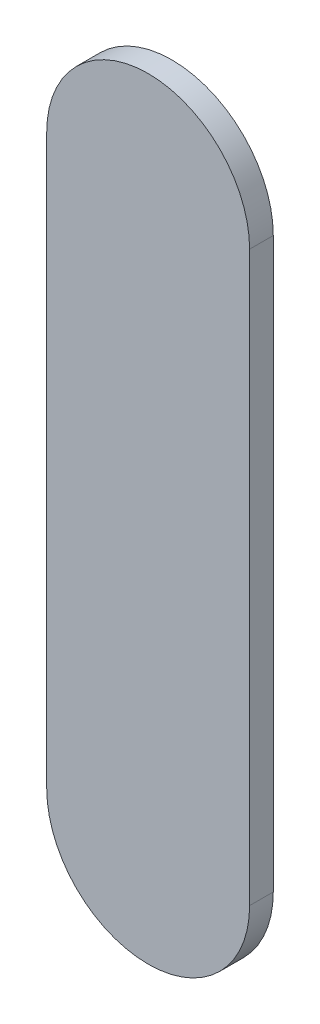
ISO-10303-21;
HEADER;
FILE_DESCRIPTION(('STEP AP214'),'2;1');
FILE_NAME('part.step','',(''),(''),'','','');
FILE_SCHEMA(('AUTOMOTIVE_DESIGN { 1 0 10303 214 1 1 1 1 }'));
ENDSEC;
DATA;
#1=APPLICATION_CONTEXT('core data for automotive mechanical design processes');
#2=APPLICATION_PROTOCOL_DEFINITION('international standard','automotive_design',2000,#1);
#3=PRODUCT_CONTEXT('',#1,'mechanical');
#4=PRODUCT('Part','Part','',(#3));
#5=PRODUCT_RELATED_PRODUCT_CATEGORY('part','',(#4));
#6=PRODUCT_DEFINITION_FORMATION('','',#4);
#7=PRODUCT_DEFINITION_CONTEXT('part definition',#1,'design');
#8=PRODUCT_DEFINITION('design','',#6,#7);
#9=PRODUCT_DEFINITION_SHAPE('','',#8);
#10=(LENGTH_UNIT() NAMED_UNIT(*) SI_UNIT(.MILLI.,.METRE.));
#11=(NAMED_UNIT(*) PLANE_ANGLE_UNIT() SI_UNIT($,.RADIAN.));
#12=(NAMED_UNIT(*) SI_UNIT($,.STERADIAN.) SOLID_ANGLE_UNIT());
#13=UNCERTAINTY_MEASURE_WITH_UNIT(LENGTH_MEASURE(1.E-05),#10,'distance_accuracy_value','');
#14=(GEOMETRIC_REPRESENTATION_CONTEXT(3) GLOBAL_UNCERTAINTY_ASSIGNED_CONTEXT((#13)) GLOBAL_UNIT_ASSIGNED_CONTEXT((#10,
#11,#12)) REPRESENTATION_CONTEXT('',''));
#15=CARTESIAN_POINT('',(0.,0.,0.));
#16=DIRECTION('',(0.,0.,1.));
#17=DIRECTION('',(1.,0.,0.));
#18=AXIS2_PLACEMENT_3D('',#15,#16,#17);
#19=CARTESIAN_POINT('',(126.65,-61.5875,1.635));
#20=DIRECTION('',(0.,0.,1.));
#21=DIRECTION('',(1.,0.,0.));
#22=AXIS2_PLACEMENT_3D('',#19,#20,#21);
#23=PLANE('',#22);
#24=DIRECTION('',(0.,1.,0.));
#25=VECTOR('',#24,1.);
#26=CARTESIAN_POINT('',(126.65,-61.5875,1.635));
#27=LINE('',#26,#25);
#28=CARTESIAN_POINT('',(126.65,-61.5875,1.635));
#29=VERTEX_POINT('',#28);
#30=CARTESIAN_POINT('',(126.65,-60.74688,1.635));
#31=VERTEX_POINT('',#30);
#32=EDGE_CURVE('E70',#29,#31,#27,.T.);
#33=ORIENTED_EDGE('',*,*,#32,.T.);
#34=CARTESIAN_POINT('',(126.5,-60.74688,1.635));
#35=DIRECTION('',(0.,0.,1.));
#36=DIRECTION('',(1.,0.,0.));
#37=AXIS2_PLACEMENT_3D('',#34,#35,#36);
#38=CIRCLE('',#37,0.15);
#39=CARTESIAN_POINT('',(126.35,-60.74688,1.635));
#40=VERTEX_POINT('',#39);
#41=EDGE_CURVE('E102',#31,#40,#38,.T.);
#42=ORIENTED_EDGE('',*,*,#41,.T.);
#43=DIRECTION('',(0.,-1.,0.));
#44=VECTOR('',#43,1.);
#45=CARTESIAN_POINT('',(126.35,-60.74688,1.635));
#46=LINE('',#45,#44);
#47=CARTESIAN_POINT('',(126.35,-61.5875,1.635));
#48=VERTEX_POINT('',#47);
#49=EDGE_CURVE('E72',#40,#48,#46,.T.);
#50=ORIENTED_EDGE('',*,*,#49,.T.);
#51=CARTESIAN_POINT('',(126.5,-61.5875,1.635));
#52=DIRECTION('',(0.,0.,1.));
#53=DIRECTION('',(-1.,0.,0.));
#54=AXIS2_PLACEMENT_3D('',#51,#52,#53);
#55=CIRCLE('',#54,0.15);
#56=EDGE_CURVE('E11',#48,#29,#55,.T.);
#57=ORIENTED_EDGE('',*,*,#56,.T.);
#58=EDGE_LOOP('',(#33,#42,#50,#57));
#59=FACE_BOUND('',#58,.T.);
#60=ADVANCED_FACE('F17',(#59),#23,.T.);
#61=CARTESIAN_POINT('',(126.65,-61.5875,1.6));
#62=DIRECTION('',(0.,0.,1.));
#63=DIRECTION('',(1.,0.,0.));
#64=AXIS2_PLACEMENT_3D('',#61,#62,#63);
#65=PLANE('',#64);
#66=CARTESIAN_POINT('',(126.5,-61.5875,1.6));
#67=DIRECTION('',(0.,0.,1.));
#68=DIRECTION('',(-1.,0.,0.));
#69=AXIS2_PLACEMENT_3D('',#66,#67,#68);
#70=CIRCLE('',#69,0.15);
#71=CARTESIAN_POINT('',(126.35,-61.5875,1.6));
#72=VERTEX_POINT('',#71);
#73=CARTESIAN_POINT('',(126.65,-61.5875,1.6));
#74=VERTEX_POINT('',#73);
#75=EDGE_CURVE('E25',#72,#74,#70,.T.);
#76=ORIENTED_EDGE('',*,*,#75,.F.);
#77=DIRECTION('',(0.,-1.,0.));
#78=VECTOR('',#77,1.);
#79=CARTESIAN_POINT('',(126.35,-60.74688,1.6));
#80=LINE('',#79,#78);
#81=CARTESIAN_POINT('',(126.35,-60.74688,1.6));
#82=VERTEX_POINT('',#81);
#83=EDGE_CURVE('E108',#82,#72,#80,.T.);
#84=ORIENTED_EDGE('',*,*,#83,.F.);
#85=CARTESIAN_POINT('',(126.5,-60.74688,1.6));
#86=DIRECTION('',(0.,0.,1.));
#87=DIRECTION('',(1.,0.,0.));
#88=AXIS2_PLACEMENT_3D('',#85,#86,#87);
#89=CIRCLE('',#88,0.15);
#90=CARTESIAN_POINT('',(126.65,-60.74688,1.6));
#91=VERTEX_POINT('',#90);
#92=EDGE_CURVE('E80',#91,#82,#89,.T.);
#93=ORIENTED_EDGE('',*,*,#92,.F.);
#94=DIRECTION('',(0.,1.,0.));
#95=VECTOR('',#94,1.);
#96=CARTESIAN_POINT('',(126.65,-61.5875,1.6));
#97=LINE('',#96,#95);
#98=EDGE_CURVE('E91',#74,#91,#97,.T.);
#99=ORIENTED_EDGE('',*,*,#98,.F.);
#100=EDGE_LOOP('',(#76,#84,#93,#99));
#101=FACE_BOUND('',#100,.T.);
#102=ADVANCED_FACE('F117',(#101),#65,.F.);
#103=CARTESIAN_POINT('',(126.5,-61.5875,1.6));
#104=DIRECTION('',(0.,0.,-1.));
#105=DIRECTION('',(-1.,0.,0.));
#106=AXIS2_PLACEMENT_3D('',#103,#104,#105);
#107=CYLINDRICAL_SURFACE('',#106,0.15);
#108=ORIENTED_EDGE('',*,*,#75,.T.);
#109=DIRECTION('',(0.,0.,1.));
#110=VECTOR('',#109,1.);
#111=CARTESIAN_POINT('',(126.65,-61.5875,1.6));
#112=LINE('',#111,#110);
#113=EDGE_CURVE('E75',#74,#29,#112,.T.);
#114=ORIENTED_EDGE('',*,*,#113,.T.);
#115=ORIENTED_EDGE('',*,*,#56,.F.);
#116=DIRECTION('',(0.,0.,1.));
#117=VECTOR('',#116,1.);
#118=CARTESIAN_POINT('',(126.35,-61.5875,1.6));
#119=LINE('',#118,#117);
#120=EDGE_CURVE('E105',#72,#48,#119,.T.);
#121=ORIENTED_EDGE('',*,*,#120,.F.);
#122=EDGE_LOOP('',(#108,#114,#115,#121));
#123=FACE_BOUND('',#122,.T.);
#124=ADVANCED_FACE('F76',(#123),#107,.T.);
#125=CARTESIAN_POINT('',(126.35,-60.74688,1.6));
#126=DIRECTION('',(1.,0.,0.));
#127=DIRECTION('',(0.,1.,0.));
#128=AXIS2_PLACEMENT_3D('',#125,#126,#127);
#129=PLANE('',#128);
#130=ORIENTED_EDGE('',*,*,#83,.T.);
#131=ORIENTED_EDGE('',*,*,#120,.T.);
#132=ORIENTED_EDGE('',*,*,#49,.F.);
#133=DIRECTION('',(0.,0.,1.));
#134=VECTOR('',#133,1.);
#135=CARTESIAN_POINT('',(126.35,-60.74688,1.6));
#136=LINE('',#135,#134);
#137=EDGE_CURVE('E98',#82,#40,#136,.T.);
#138=ORIENTED_EDGE('',*,*,#137,.F.);
#139=EDGE_LOOP('',(#130,#131,#132,#138));
#140=FACE_BOUND('',#139,.T.);
#141=ADVANCED_FACE('F116',(#140),#129,.F.);
#142=CARTESIAN_POINT('',(126.5,-60.74688,1.6));
#143=DIRECTION('',(0.,0.,-1.));
#144=DIRECTION('',(1.,0.,0.));
#145=AXIS2_PLACEMENT_3D('',#142,#143,#144);
#146=CYLINDRICAL_SURFACE('',#145,0.15);
#147=ORIENTED_EDGE('',*,*,#92,.T.);
#148=ORIENTED_EDGE('',*,*,#137,.T.);
#149=ORIENTED_EDGE('',*,*,#41,.F.);
#150=DIRECTION('',(0.,0.,1.));
#151=VECTOR('',#150,1.);
#152=CARTESIAN_POINT('',(126.65,-60.74688,1.6));
#153=LINE('',#152,#151);
#154=EDGE_CURVE('E84',#91,#31,#153,.T.);
#155=ORIENTED_EDGE('',*,*,#154,.F.);
#156=EDGE_LOOP('',(#147,#148,#149,#155));
#157=FACE_BOUND('',#156,.T.);
#158=ADVANCED_FACE('F119',(#157),#146,.T.);
#159=CARTESIAN_POINT('',(126.65,-61.5875,1.6));
#160=DIRECTION('',(-1.,0.,0.));
#161=DIRECTION('',(0.,0.,1.));
#162=AXIS2_PLACEMENT_3D('',#159,#160,#161);
#163=PLANE('',#162);
#164=ORIENTED_EDGE('',*,*,#98,.T.);
#165=ORIENTED_EDGE('',*,*,#154,.T.);
#166=ORIENTED_EDGE('',*,*,#32,.F.);
#167=ORIENTED_EDGE('',*,*,#113,.F.);
#168=EDGE_LOOP('',(#164,#165,#166,#167));
#169=FACE_BOUND('',#168,.T.);
#170=ADVANCED_FACE('F82',(#169),#163,.F.);
#171=CLOSED_SHELL('',(#60,#102,#124,#141,#158,#170));
#172=MANIFOLD_SOLID_BREP('B1',#171);
#173=ADVANCED_BREP_SHAPE_REPRESENTATION('',(#18,#172),#14);
#174=SHAPE_DEFINITION_REPRESENTATION(#9,#173);
ENDSEC;
END-ISO-10303-21;
